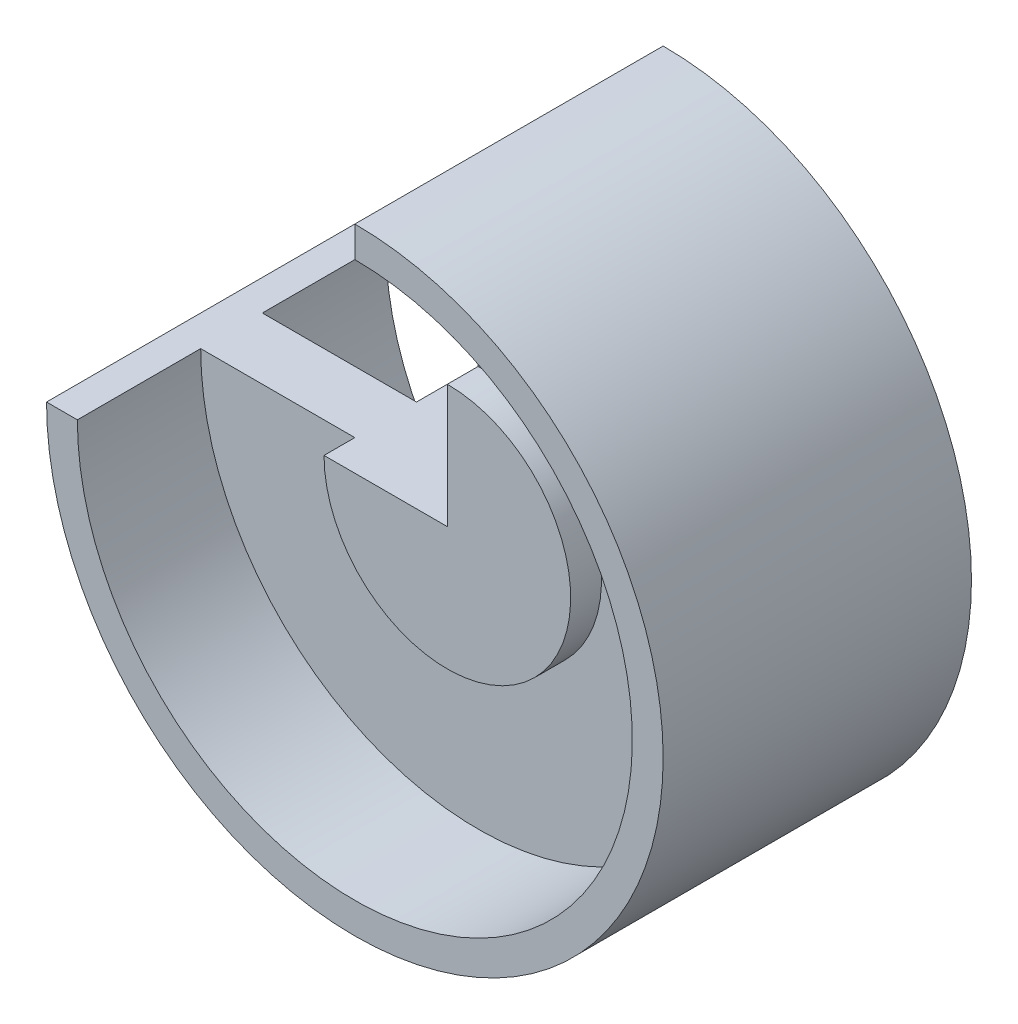
ISO-10303-21;
HEADER;
FILE_DESCRIPTION(('STEP AP214'),'2;1');
FILE_NAME('part.step','',(''),(''),'','','');
FILE_SCHEMA(('AUTOMOTIVE_DESIGN { 1 0 10303 214 1 1 1 1 }'));
ENDSEC;
DATA;
#1=APPLICATION_CONTEXT('core data for automotive mechanical design processes');
#2=APPLICATION_PROTOCOL_DEFINITION('international standard','automotive_design',2000,#1);
#3=PRODUCT_CONTEXT('',#1,'mechanical');
#4=PRODUCT('Part','Part','',(#3));
#5=PRODUCT_RELATED_PRODUCT_CATEGORY('part','',(#4));
#6=PRODUCT_DEFINITION_FORMATION('','',#4);
#7=PRODUCT_DEFINITION_CONTEXT('part definition',#1,'design');
#8=PRODUCT_DEFINITION('design','',#6,#7);
#9=PRODUCT_DEFINITION_SHAPE('','',#8);
#10=(LENGTH_UNIT() NAMED_UNIT(*) SI_UNIT(.MILLI.,.METRE.));
#11=(NAMED_UNIT(*) PLANE_ANGLE_UNIT() SI_UNIT($,.RADIAN.));
#12=(NAMED_UNIT(*) SI_UNIT($,.STERADIAN.) SOLID_ANGLE_UNIT());
#13=UNCERTAINTY_MEASURE_WITH_UNIT(LENGTH_MEASURE(1.E-05),#10,'distance_accuracy_value','');
#14=(GEOMETRIC_REPRESENTATION_CONTEXT(3) GLOBAL_UNCERTAINTY_ASSIGNED_CONTEXT((#13)) GLOBAL_UNIT_ASSIGNED_CONTEXT((#10,
#11,#12)) REPRESENTATION_CONTEXT('',''));
#15=CARTESIAN_POINT('',(0.,0.,0.));
#16=DIRECTION('',(0.,0.,1.));
#17=DIRECTION('',(1.,0.,0.));
#18=AXIS2_PLACEMENT_3D('',#15,#16,#17);
#19=CARTESIAN_POINT('',(0.,0.,0.));
#20=DIRECTION('',(0.,0.,1.));
#21=DIRECTION('',(1.,0.,0.));
#22=AXIS2_PLACEMENT_3D('',#19,#20,#21);
#23=CYLINDRICAL_SURFACE('',#22,50.);
#24=CARTESIAN_POINT('',(0.,0.,25.));
#25=DIRECTION('',(0.,0.,1.));
#26=DIRECTION('',(1.,0.,0.));
#27=AXIS2_PLACEMENT_3D('',#24,#25,#26);
#28=CIRCLE('',#27,50.);
#29=CARTESIAN_POINT('',(-50.,5.2372220082647E-13,25.));
#30=VERTEX_POINT('',#29);
#31=CARTESIAN_POINT('',(0.,50.,25.));
#32=VERTEX_POINT('',#31);
#33=EDGE_CURVE('E11',#30,#32,#28,.T.);
#34=ORIENTED_EDGE('',*,*,#33,.F.);
#35=DIRECTION('',(0.,0.,-1.));
#36=VECTOR('',#35,1.);
#37=CARTESIAN_POINT('',(-50.,5.2372220082647E-13,0.));
#38=LINE('',#37,#36);
#39=CARTESIAN_POINT('',(-50.,5.2372220082647E-13,-25.));
#40=VERTEX_POINT('',#39);
#41=EDGE_CURVE('E163',#30,#40,#38,.T.);
#42=ORIENTED_EDGE('',*,*,#41,.T.);
#43=CARTESIAN_POINT('',(0.,0.,-25.));
#44=DIRECTION('',(0.,0.,1.));
#45=DIRECTION('',(1.,0.,0.));
#46=AXIS2_PLACEMENT_3D('',#43,#44,#45);
#47=CIRCLE('',#46,50.);
#48=CARTESIAN_POINT('',(0.,50.,-25.));
#49=VERTEX_POINT('',#48);
#50=EDGE_CURVE('E53',#40,#49,#47,.T.);
#51=ORIENTED_EDGE('',*,*,#50,.T.);
#52=DIRECTION('',(0.,0.,-1.));
#53=VECTOR('',#52,1.);
#54=CARTESIAN_POINT('',(0.,50.,0.));
#55=LINE('',#54,#53);
#56=EDGE_CURVE('E131',#32,#49,#55,.T.);
#57=ORIENTED_EDGE('',*,*,#56,.F.);
#58=EDGE_LOOP('',(#34,#42,#51,#57));
#59=FACE_BOUND('',#58,.T.);
#60=ADVANCED_FACE('F39',(#59),#23,.T.);
#61=CARTESIAN_POINT('',(0.,0.,25.));
#62=DIRECTION('',(0.,0.,1.));
#63=DIRECTION('',(1.,0.,0.));
#64=AXIS2_PLACEMENT_3D('',#61,#62,#63);
#65=PLANE('',#64);
#66=CARTESIAN_POINT('',(0.,0.,25.));
#67=DIRECTION('',(0.,0.,1.));
#68=DIRECTION('',(1.,0.,0.));
#69=AXIS2_PLACEMENT_3D('',#66,#67,#68);
#70=CIRCLE('',#69,45.);
#71=CARTESIAN_POINT('',(-45.,4.71349980743823E-13,25.));
#72=VERTEX_POINT('',#71);
#73=CARTESIAN_POINT('',(0.,45.,25.));
#74=VERTEX_POINT('',#73);
#75=EDGE_CURVE('E50',#72,#74,#70,.T.);
#76=ORIENTED_EDGE('',*,*,#75,.F.);
#77=DIRECTION('',(-1.,0.,0.));
#78=VECTOR('',#77,1.);
#79=CARTESIAN_POINT('',(0.,0.,25.));
#80=LINE('',#79,#78);
#81=EDGE_CURVE('E126',#72,#30,#80,.T.);
#82=ORIENTED_EDGE('',*,*,#81,.T.);
#83=ORIENTED_EDGE('',*,*,#33,.T.);
#84=DIRECTION('',(0.,1.,0.));
#85=VECTOR('',#84,1.);
#86=CARTESIAN_POINT('',(0.,0.,25.));
#87=LINE('',#86,#85);
#88=EDGE_CURVE('E124',#74,#32,#87,.T.);
#89=ORIENTED_EDGE('',*,*,#88,.F.);
#90=EDGE_LOOP('',(#76,#82,#83,#89));
#91=FACE_BOUND('',#90,.T.);
#92=ADVANCED_FACE('F41',(#91),#65,.T.);
#93=CARTESIAN_POINT('',(0.,0.,0.));
#94=DIRECTION('',(0.,0.,1.));
#95=DIRECTION('',(1.,0.,0.));
#96=AXIS2_PLACEMENT_3D('',#93,#94,#95);
#97=CYLINDRICAL_SURFACE('',#96,45.);
#98=CARTESIAN_POINT('',(0.,0.,5.));
#99=DIRECTION('',(0.,0.,1.));
#100=DIRECTION('',(1.,0.,0.));
#101=AXIS2_PLACEMENT_3D('',#98,#99,#100);
#102=CIRCLE('',#101,45.);
#103=CARTESIAN_POINT('',(-45.,4.71349980743823E-13,5.));
#104=VERTEX_POINT('',#103);
#105=CARTESIAN_POINT('',(0.,45.,5.));
#106=VERTEX_POINT('',#105);
#107=EDGE_CURVE('E208',#104,#106,#102,.T.);
#108=ORIENTED_EDGE('',*,*,#107,.F.);
#109=DIRECTION('',(0.,0.,1.));
#110=VECTOR('',#109,1.);
#111=CARTESIAN_POINT('',(-45.,4.71349980743823E-13,0.));
#112=LINE('',#111,#110);
#113=EDGE_CURVE('E170',#104,#72,#112,.T.);
#114=ORIENTED_EDGE('',*,*,#113,.T.);
#115=ORIENTED_EDGE('',*,*,#75,.T.);
#116=DIRECTION('',(0.,0.,1.));
#117=VECTOR('',#116,1.);
#118=CARTESIAN_POINT('',(0.,45.,0.));
#119=LINE('',#118,#117);
#120=EDGE_CURVE('E137',#106,#74,#119,.T.);
#121=ORIENTED_EDGE('',*,*,#120,.F.);
#122=EDGE_LOOP('',(#108,#114,#115,#121));
#123=FACE_BOUND('',#122,.T.);
#124=ADVANCED_FACE('F209',(#123),#97,.F.);
#125=CARTESIAN_POINT('',(0.,0.,5.));
#126=DIRECTION('',(0.,0.,1.));
#127=DIRECTION('',(1.,0.,0.));
#128=AXIS2_PLACEMENT_3D('',#125,#126,#127);
#129=PLANE('',#128);
#130=CARTESIAN_POINT('',(0.,0.,5.));
#131=DIRECTION('',(0.,0.,1.));
#132=DIRECTION('',(1.,0.,0.));
#133=AXIS2_PLACEMENT_3D('',#130,#131,#132);
#134=CIRCLE('',#133,20.);
#135=CARTESIAN_POINT('',(-20.,2.09488880330588E-13,5.));
#136=VERTEX_POINT('',#135);
#137=CARTESIAN_POINT('',(0.,20.,5.));
#138=VERTEX_POINT('',#137);
#139=EDGE_CURVE('E206',#136,#138,#134,.T.);
#140=ORIENTED_EDGE('',*,*,#139,.F.);
#141=DIRECTION('',(-1.,0.,0.));
#142=VECTOR('',#141,1.);
#143=CARTESIAN_POINT('',(0.,0.,5.));
#144=LINE('',#143,#142);
#145=EDGE_CURVE('E168',#136,#104,#144,.T.);
#146=ORIENTED_EDGE('',*,*,#145,.T.);
#147=ORIENTED_EDGE('',*,*,#107,.T.);
#148=DIRECTION('',(0.,1.,0.));
#149=VECTOR('',#148,1.);
#150=CARTESIAN_POINT('',(0.,0.,5.));
#151=LINE('',#150,#149);
#152=EDGE_CURVE('E143',#138,#106,#151,.T.);
#153=ORIENTED_EDGE('',*,*,#152,.F.);
#154=EDGE_LOOP('',(#140,#146,#147,#153));
#155=FACE_BOUND('',#154,.T.);
#156=ADVANCED_FACE('F239',(#155),#129,.T.);
#157=CARTESIAN_POINT('',(0.,0.,0.));
#158=DIRECTION('',(0.,0.,1.));
#159=DIRECTION('',(1.,0.,0.));
#160=AXIS2_PLACEMENT_3D('',#157,#158,#159);
#161=CYLINDRICAL_SURFACE('',#160,20.);
#162=CARTESIAN_POINT('',(0.,0.,10.));
#163=DIRECTION('',(0.,0.,1.));
#164=DIRECTION('',(1.,0.,0.));
#165=AXIS2_PLACEMENT_3D('',#162,#163,#164);
#166=CIRCLE('',#165,20.);
#167=CARTESIAN_POINT('',(-20.,2.09488880330588E-13,10.));
#168=VERTEX_POINT('',#167);
#169=CARTESIAN_POINT('',(0.,20.,10.));
#170=VERTEX_POINT('',#169);
#171=EDGE_CURVE('E204',#168,#170,#166,.T.);
#172=ORIENTED_EDGE('',*,*,#171,.F.);
#173=DIRECTION('',(0.,0.,-1.));
#174=VECTOR('',#173,1.);
#175=CARTESIAN_POINT('',(-20.,2.09488880330588E-13,0.));
#176=LINE('',#175,#174);
#177=EDGE_CURVE('E175',#168,#136,#176,.T.);
#178=ORIENTED_EDGE('',*,*,#177,.T.);
#179=ORIENTED_EDGE('',*,*,#139,.T.);
#180=DIRECTION('',(0.,0.,-1.));
#181=VECTOR('',#180,1.);
#182=CARTESIAN_POINT('',(0.,20.,0.));
#183=LINE('',#182,#181);
#184=EDGE_CURVE('E144',#170,#138,#183,.T.);
#185=ORIENTED_EDGE('',*,*,#184,.F.);
#186=EDGE_LOOP('',(#172,#178,#179,#185));
#187=FACE_BOUND('',#186,.T.);
#188=ADVANCED_FACE('F240',(#187),#161,.T.);
#189=CARTESIAN_POINT('',(0.,0.,10.));
#190=DIRECTION('',(0.,0.,1.));
#191=DIRECTION('',(1.,0.,0.));
#192=AXIS2_PLACEMENT_3D('',#189,#190,#191);
#193=PLANE('',#192);
#194=DIRECTION('',(0.,1.,0.));
#195=VECTOR('',#194,1.);
#196=CARTESIAN_POINT('',(0.,0.,10.));
#197=LINE('',#196,#195);
#198=CARTESIAN_POINT('',(0.,0.,10.));
#199=VERTEX_POINT('',#198);
#200=EDGE_CURVE('E146',#199,#170,#197,.T.);
#201=ORIENTED_EDGE('',*,*,#200,.F.);
#202=DIRECTION('',(-1.,0.,0.));
#203=VECTOR('',#202,1.);
#204=CARTESIAN_POINT('',(0.,0.,10.));
#205=LINE('',#204,#203);
#206=EDGE_CURVE('E176',#199,#168,#205,.T.);
#207=ORIENTED_EDGE('',*,*,#206,.T.);
#208=ORIENTED_EDGE('',*,*,#171,.T.);
#209=EDGE_LOOP('',(#201,#207,#208));
#210=FACE_BOUND('',#209,.T.);
#211=ADVANCED_FACE('F233',(#210),#193,.T.);
#212=CARTESIAN_POINT('',(0.,0.,-10.));
#213=DIRECTION('',(0.,0.,1.));
#214=DIRECTION('',(1.,0.,0.));
#215=AXIS2_PLACEMENT_3D('',#212,#213,#214);
#216=PLANE('',#215);
#217=CARTESIAN_POINT('',(0.,0.,-10.));
#218=DIRECTION('',(0.,0.,1.));
#219=DIRECTION('',(1.,0.,0.));
#220=AXIS2_PLACEMENT_3D('',#217,#218,#219);
#221=CIRCLE('',#220,20.);
#222=CARTESIAN_POINT('',(-20.,2.09488880330588E-13,-10.));
#223=VERTEX_POINT('',#222);
#224=CARTESIAN_POINT('',(0.,20.,-10.));
#225=VERTEX_POINT('',#224);
#226=EDGE_CURVE('E205',#223,#225,#221,.T.);
#227=ORIENTED_EDGE('',*,*,#226,.F.);
#228=DIRECTION('',(-1.,0.,0.));
#229=VECTOR('',#228,1.);
#230=CARTESIAN_POINT('',(0.,0.,-10.));
#231=LINE('',#230,#229);
#232=CARTESIAN_POINT('',(0.,0.,-10.));
#233=VERTEX_POINT('',#232);
#234=EDGE_CURVE('E185',#233,#223,#231,.T.);
#235=ORIENTED_EDGE('',*,*,#234,.F.);
#236=DIRECTION('',(0.,1.,0.));
#237=VECTOR('',#236,1.);
#238=CARTESIAN_POINT('',(0.,0.,-10.));
#239=LINE('',#238,#237);
#240=EDGE_CURVE('E151',#233,#225,#239,.T.);
#241=ORIENTED_EDGE('',*,*,#240,.T.);
#242=EDGE_LOOP('',(#227,#235,#241));
#243=FACE_BOUND('',#242,.T.);
#244=ADVANCED_FACE('F230',(#243),#216,.F.);
#245=CARTESIAN_POINT('',(0.,0.,0.));
#246=DIRECTION('',(0.,0.,1.));
#247=DIRECTION('',(1.,0.,0.));
#248=AXIS2_PLACEMENT_3D('',#245,#246,#247);
#249=CYLINDRICAL_SURFACE('',#248,20.);
#250=CARTESIAN_POINT('',(0.,0.,-5.));
#251=DIRECTION('',(0.,0.,1.));
#252=DIRECTION('',(1.,0.,0.));
#253=AXIS2_PLACEMENT_3D('',#250,#251,#252);
#254=CIRCLE('',#253,20.);
#255=CARTESIAN_POINT('',(-20.,2.09488880330588E-13,-5.));
#256=VERTEX_POINT('',#255);
#257=CARTESIAN_POINT('',(0.,20.,-5.));
#258=VERTEX_POINT('',#257);
#259=EDGE_CURVE('E199',#256,#258,#254,.T.);
#260=ORIENTED_EDGE('',*,*,#259,.F.);
#261=DIRECTION('',(0.,0.,1.));
#262=VECTOR('',#261,1.);
#263=CARTESIAN_POINT('',(-20.,2.09488880330588E-13,0.));
#264=LINE('',#263,#262);
#265=EDGE_CURVE('E183',#223,#256,#264,.T.);
#266=ORIENTED_EDGE('',*,*,#265,.F.);
#267=ORIENTED_EDGE('',*,*,#226,.T.);
#268=DIRECTION('',(0.,0.,1.));
#269=VECTOR('',#268,1.);
#270=CARTESIAN_POINT('',(0.,20.,0.));
#271=LINE('',#270,#269);
#272=EDGE_CURVE('E152',#225,#258,#271,.T.);
#273=ORIENTED_EDGE('',*,*,#272,.T.);
#274=EDGE_LOOP('',(#260,#266,#267,#273));
#275=FACE_BOUND('',#274,.T.);
#276=ADVANCED_FACE('F223',(#275),#249,.T.);
#277=CARTESIAN_POINT('',(0.,0.,-5.));
#278=DIRECTION('',(0.,0.,1.));
#279=DIRECTION('',(1.,0.,0.));
#280=AXIS2_PLACEMENT_3D('',#277,#278,#279);
#281=PLANE('',#280);
#282=CARTESIAN_POINT('',(0.,0.,-5.));
#283=DIRECTION('',(0.,0.,1.));
#284=DIRECTION('',(1.,0.,0.));
#285=AXIS2_PLACEMENT_3D('',#282,#283,#284);
#286=CIRCLE('',#285,45.);
#287=CARTESIAN_POINT('',(-45.,4.71349980743823E-13,-5.));
#288=VERTEX_POINT('',#287);
#289=CARTESIAN_POINT('',(0.,45.,-5.));
#290=VERTEX_POINT('',#289);
#291=EDGE_CURVE('E196',#288,#290,#286,.T.);
#292=ORIENTED_EDGE('',*,*,#291,.F.);
#293=DIRECTION('',(-1.,0.,0.));
#294=VECTOR('',#293,1.);
#295=CARTESIAN_POINT('',(0.,0.,-5.));
#296=LINE('',#295,#294);
#297=EDGE_CURVE('E190',#256,#288,#296,.T.);
#298=ORIENTED_EDGE('',*,*,#297,.F.);
#299=ORIENTED_EDGE('',*,*,#259,.T.);
#300=DIRECTION('',(0.,1.,0.));
#301=VECTOR('',#300,1.);
#302=CARTESIAN_POINT('',(0.,0.,-5.));
#303=LINE('',#302,#301);
#304=EDGE_CURVE('E160',#258,#290,#303,.T.);
#305=ORIENTED_EDGE('',*,*,#304,.T.);
#306=EDGE_LOOP('',(#292,#298,#299,#305));
#307=FACE_BOUND('',#306,.T.);
#308=ADVANCED_FACE('F222',(#307),#281,.F.);
#309=CARTESIAN_POINT('',(0.,0.,0.));
#310=DIRECTION('',(0.,0.,1.));
#311=DIRECTION('',(1.,0.,0.));
#312=AXIS2_PLACEMENT_3D('',#309,#310,#311);
#313=CYLINDRICAL_SURFACE('',#312,45.);
#314=CARTESIAN_POINT('',(0.,0.,-25.));
#315=DIRECTION('',(0.,0.,1.));
#316=DIRECTION('',(1.,0.,0.));
#317=AXIS2_PLACEMENT_3D('',#314,#315,#316);
#318=CIRCLE('',#317,45.);
#319=CARTESIAN_POINT('',(-45.,4.71349980743823E-13,-25.));
#320=VERTEX_POINT('',#319);
#321=CARTESIAN_POINT('',(0.,45.,-25.));
#322=VERTEX_POINT('',#321);
#323=EDGE_CURVE('E61',#320,#322,#318,.T.);
#324=ORIENTED_EDGE('',*,*,#323,.F.);
#325=DIRECTION('',(0.,0.,-1.));
#326=VECTOR('',#325,1.);
#327=CARTESIAN_POINT('',(-45.,4.71349980743823E-13,0.));
#328=LINE('',#327,#326);
#329=EDGE_CURVE('E191',#288,#320,#328,.T.);
#330=ORIENTED_EDGE('',*,*,#329,.F.);
#331=ORIENTED_EDGE('',*,*,#291,.T.);
#332=DIRECTION('',(0.,0.,-1.));
#333=VECTOR('',#332,1.);
#334=CARTESIAN_POINT('',(0.,45.,0.));
#335=LINE('',#334,#333);
#336=EDGE_CURVE('E159',#290,#322,#335,.T.);
#337=ORIENTED_EDGE('',*,*,#336,.T.);
#338=EDGE_LOOP('',(#324,#330,#331,#337));
#339=FACE_BOUND('',#338,.T.);
#340=ADVANCED_FACE('F220',(#339),#313,.F.);
#341=CARTESIAN_POINT('',(0.,0.,-25.));
#342=DIRECTION('',(0.,0.,1.));
#343=DIRECTION('',(1.,0.,0.));
#344=AXIS2_PLACEMENT_3D('',#341,#342,#343);
#345=PLANE('',#344);
#346=DIRECTION('',(-1.,0.,0.));
#347=VECTOR('',#346,1.);
#348=CARTESIAN_POINT('',(0.,0.,-25.));
#349=LINE('',#348,#347);
#350=EDGE_CURVE('E193',#320,#40,#349,.T.);
#351=ORIENTED_EDGE('',*,*,#350,.F.);
#352=ORIENTED_EDGE('',*,*,#323,.T.);
#353=DIRECTION('',(0.,1.,0.));
#354=VECTOR('',#353,1.);
#355=CARTESIAN_POINT('',(0.,0.,-25.));
#356=LINE('',#355,#354);
#357=EDGE_CURVE('E165',#322,#49,#356,.T.);
#358=ORIENTED_EDGE('',*,*,#357,.T.);
#359=ORIENTED_EDGE('',*,*,#50,.F.);
#360=EDGE_LOOP('',(#351,#352,#358,#359));
#361=FACE_BOUND('',#360,.T.);
#362=ADVANCED_FACE('F214',(#361),#345,.F.);
#363=CARTESIAN_POINT('',(0.,0.,0.));
#364=DIRECTION('',(0.,1.,0.));
#365=DIRECTION('',(0.,0.,-1.));
#366=AXIS2_PLACEMENT_3D('',#363,#364,#365);
#367=PLANE('',#366);
#368=ORIENTED_EDGE('',*,*,#41,.F.);
#369=ORIENTED_EDGE('',*,*,#81,.F.);
#370=ORIENTED_EDGE('',*,*,#113,.F.);
#371=ORIENTED_EDGE('',*,*,#145,.F.);
#372=ORIENTED_EDGE('',*,*,#177,.F.);
#373=ORIENTED_EDGE('',*,*,#206,.F.);
#374=DIRECTION('',(0.,0.,-1.));
#375=VECTOR('',#374,1.);
#376=CARTESIAN_POINT('',(0.,0.,0.));
#377=LINE('',#376,#375);
#378=EDGE_CURVE('E177',#199,#233,#377,.T.);
#379=ORIENTED_EDGE('',*,*,#378,.T.);
#380=ORIENTED_EDGE('',*,*,#234,.T.);
#381=ORIENTED_EDGE('',*,*,#265,.T.);
#382=ORIENTED_EDGE('',*,*,#297,.T.);
#383=ORIENTED_EDGE('',*,*,#329,.T.);
#384=ORIENTED_EDGE('',*,*,#350,.T.);
#385=EDGE_LOOP('',(#368,#369,#370,#371,#372,#373,#379,#380,#381,#382,#383,#384));
#386=FACE_BOUND('',#385,.T.);
#387=ADVANCED_FACE('F213',(#386),#367,.T.);
#388=CARTESIAN_POINT('',(0.,0.,0.));
#389=DIRECTION('',(1.,0.,0.));
#390=DIRECTION('',(0.,0.,-1.));
#391=AXIS2_PLACEMENT_3D('',#388,#389,#390);
#392=PLANE('',#391);
#393=ORIENTED_EDGE('',*,*,#56,.T.);
#394=ORIENTED_EDGE('',*,*,#357,.F.);
#395=ORIENTED_EDGE('',*,*,#336,.F.);
#396=ORIENTED_EDGE('',*,*,#304,.F.);
#397=ORIENTED_EDGE('',*,*,#272,.F.);
#398=ORIENTED_EDGE('',*,*,#240,.F.);
#399=ORIENTED_EDGE('',*,*,#378,.F.);
#400=ORIENTED_EDGE('',*,*,#200,.T.);
#401=ORIENTED_EDGE('',*,*,#184,.T.);
#402=ORIENTED_EDGE('',*,*,#152,.T.);
#403=ORIENTED_EDGE('',*,*,#120,.T.);
#404=ORIENTED_EDGE('',*,*,#88,.T.);
#405=EDGE_LOOP('',(#393,#394,#395,#396,#397,#398,#399,#400,#401,#402,#403,#404));
#406=FACE_BOUND('',#405,.T.);
#407=ADVANCED_FACE('F136',(#406),#392,.F.);
#408=CLOSED_SHELL('',(#60,#92,#124,#156,#188,#211,#244,#276,#308,#340,#362,#387,#407));
#409=MANIFOLD_SOLID_BREP('B2',#408);
#410=ADVANCED_BREP_SHAPE_REPRESENTATION('',(#18,#409),#14);
#411=SHAPE_DEFINITION_REPRESENTATION(#9,#410);
ENDSEC;
END-ISO-10303-21;
